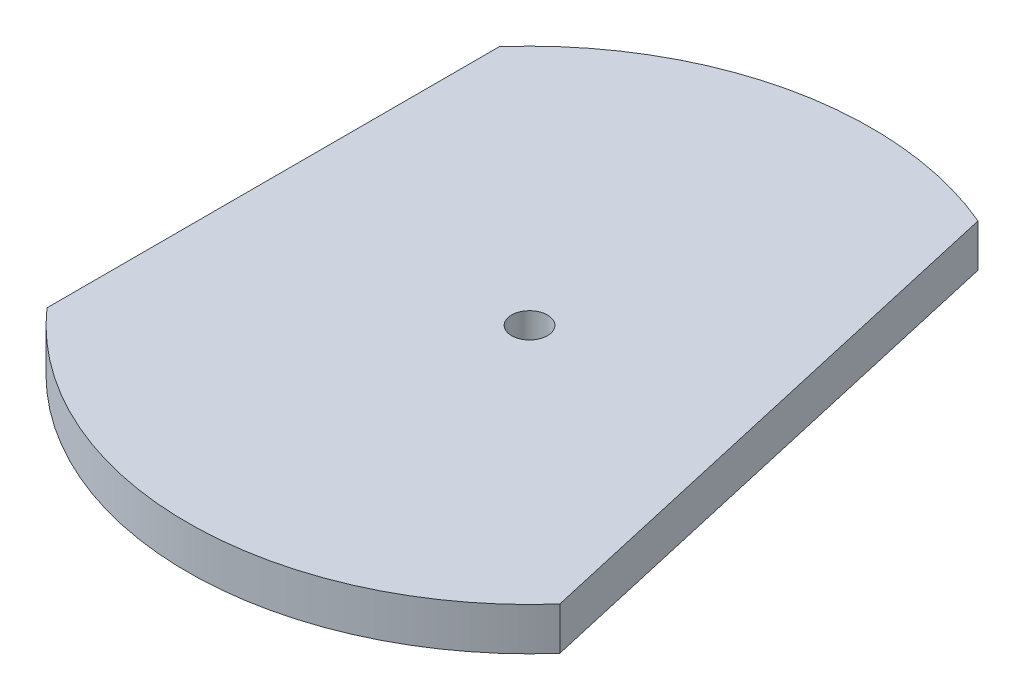
ISO-10303-21;
HEADER;
FILE_DESCRIPTION(('STEP AP214'),'2;1');
FILE_NAME('part.step','',(''),(''),'','','');
FILE_SCHEMA(('AUTOMOTIVE_DESIGN { 1 0 10303 214 1 1 1 1 }'));
ENDSEC;
DATA;
#1=APPLICATION_CONTEXT('core data for automotive mechanical design processes');
#2=APPLICATION_PROTOCOL_DEFINITION('international standard','automotive_design',2000,#1);
#3=PRODUCT_CONTEXT('',#1,'mechanical');
#4=PRODUCT('Part','Part','',(#3));
#5=PRODUCT_RELATED_PRODUCT_CATEGORY('part','',(#4));
#6=PRODUCT_DEFINITION_FORMATION('','',#4);
#7=PRODUCT_DEFINITION_CONTEXT('part definition',#1,'design');
#8=PRODUCT_DEFINITION('design','',#6,#7);
#9=PRODUCT_DEFINITION_SHAPE('','',#8);
#10=(LENGTH_UNIT() NAMED_UNIT(*) SI_UNIT(.MILLI.,.METRE.));
#11=(NAMED_UNIT(*) PLANE_ANGLE_UNIT() SI_UNIT($,.RADIAN.));
#12=(NAMED_UNIT(*) SI_UNIT($,.STERADIAN.) SOLID_ANGLE_UNIT());
#13=UNCERTAINTY_MEASURE_WITH_UNIT(LENGTH_MEASURE(1.E-05),#10,'distance_accuracy_value','');
#14=(GEOMETRIC_REPRESENTATION_CONTEXT(3) GLOBAL_UNCERTAINTY_ASSIGNED_CONTEXT((#13)) GLOBAL_UNIT_ASSIGNED_CONTEXT((#10,
#11,#12)) REPRESENTATION_CONTEXT('',''));
#15=CARTESIAN_POINT('',(0.,0.,0.));
#16=DIRECTION('',(0.,0.,1.));
#17=DIRECTION('',(1.,0.,0.));
#18=AXIS2_PLACEMENT_3D('',#15,#16,#17);
#19=CARTESIAN_POINT('',(0.,6.35,0.));
#20=DIRECTION('',(0.,1.,0.));
#21=DIRECTION('',(0.,0.,1.));
#22=AXIS2_PLACEMENT_3D('',#19,#20,#21);
#23=PLANE('',#22);
#24=CARTESIAN_POINT('',(0.,6.35,0.));
#25=DIRECTION('',(0.,1.,0.));
#26=DIRECTION('',(0.,0.,1.));
#27=AXIS2_PLACEMENT_3D('',#24,#25,#26);
#28=CIRCLE('',#27,2.66666666666667);
#29=CARTESIAN_POINT('',(0.,6.35,2.66666666666667));
#30=VERTEX_POINT('',#29);
#31=EDGE_CURVE('E96',#30,#30,#28,.T.);
#32=ORIENTED_EDGE('',*,*,#31,.F.);
#33=EDGE_LOOP('',(#32));
#34=FACE_BOUND('',#33,.T.);
#35=CARTESIAN_POINT('',(0.,6.35,0.));
#36=DIRECTION('',(0.,1.,0.));
#37=DIRECTION('',(0.,0.,1.));
#38=AXIS2_PLACEMENT_3D('',#35,#36,#37);
#39=CIRCLE('',#38,50.8);
#40=CARTESIAN_POINT('',(-38.1,6.35,33.6010416505203));
#41=VERTEX_POINT('',#40);
#42=CARTESIAN_POINT('',(38.1,6.35,33.6010416505203));
#43=VERTEX_POINT('',#42);
#44=EDGE_CURVE('E84',#41,#43,#39,.T.);
#45=ORIENTED_EDGE('',*,*,#44,.T.);
#46=DIRECTION('',(-0.221162934232346,0.,-0.975236872006868));
#47=VECTOR('',#46,1.);
#48=CARTESIAN_POINT('',(28.9891304347826,6.35,-6.57411684466701));
#49=LINE('',#48,#47);
#50=CARTESIAN_POINT('',(19.8782608695652,6.35,-46.7492753398543));
#51=VERTEX_POINT('',#50);
#52=EDGE_CURVE('E77',#43,#51,#49,.T.);
#53=ORIENTED_EDGE('',*,*,#52,.T.);
#54=CARTESIAN_POINT('',(-38.1,6.35,-33.6010416505203));
#55=VERTEX_POINT('',#54);
#56=EDGE_CURVE('E48',#51,#55,#39,.T.);
#57=ORIENTED_EDGE('',*,*,#56,.T.);
#58=DIRECTION('',(0.,0.,-1.));
#59=VECTOR('',#58,1.);
#60=CARTESIAN_POINT('',(-38.1,6.35,0.));
#61=LINE('',#60,#59);
#62=EDGE_CURVE('E105',#41,#55,#61,.T.);
#63=ORIENTED_EDGE('',*,*,#62,.F.);
#64=EDGE_LOOP('',(#45,#53,#57,#63));
#65=FACE_BOUND('',#64,.T.);
#66=ADVANCED_FACE('F33',(#34,#65),#23,.T.);
#67=CARTESIAN_POINT('',(0.,0.,0.));
#68=DIRECTION('',(0.,1.,0.));
#69=DIRECTION('',(0.,0.,1.));
#70=AXIS2_PLACEMENT_3D('',#67,#68,#69);
#71=PLANE('',#70);
#72=CARTESIAN_POINT('',(0.,0.,0.));
#73=DIRECTION('',(0.,1.,0.));
#74=DIRECTION('',(0.,0.,1.));
#75=AXIS2_PLACEMENT_3D('',#72,#73,#74);
#76=CIRCLE('',#75,2.66666666666667);
#77=CARTESIAN_POINT('',(0.,0.,2.66666666666667));
#78=VERTEX_POINT('',#77);
#79=EDGE_CURVE('E92',#78,#78,#76,.T.);
#80=ORIENTED_EDGE('',*,*,#79,.T.);
#81=EDGE_LOOP('',(#80));
#82=FACE_BOUND('',#81,.T.);
#83=DIRECTION('',(-0.221162934232346,0.,-0.975236872006868));
#84=VECTOR('',#83,1.);
#85=CARTESIAN_POINT('',(28.9891304347826,0.,-6.57411684466701));
#86=LINE('',#85,#84);
#87=CARTESIAN_POINT('',(38.1,0.,33.6010416505203));
#88=VERTEX_POINT('',#87);
#89=CARTESIAN_POINT('',(19.8782608695652,0.,-46.7492753398543));
#90=VERTEX_POINT('',#89);
#91=EDGE_CURVE('E80',#88,#90,#86,.T.);
#92=ORIENTED_EDGE('',*,*,#91,.F.);
#93=CARTESIAN_POINT('',(0.,0.,0.));
#94=DIRECTION('',(0.,1.,0.));
#95=DIRECTION('',(0.,0.,1.));
#96=AXIS2_PLACEMENT_3D('',#93,#94,#95);
#97=CIRCLE('',#96,50.8);
#98=CARTESIAN_POINT('',(-38.1,0.,33.6010416505203));
#99=VERTEX_POINT('',#98);
#100=EDGE_CURVE('E94',#99,#88,#97,.T.);
#101=ORIENTED_EDGE('',*,*,#100,.F.);
#102=DIRECTION('',(0.,0.,-1.));
#103=VECTOR('',#102,1.);
#104=CARTESIAN_POINT('',(-38.1,0.,0.));
#105=LINE('',#104,#103);
#106=CARTESIAN_POINT('',(-38.1,0.,-33.6010416505203));
#107=VERTEX_POINT('',#106);
#108=EDGE_CURVE('E104',#99,#107,#105,.T.);
#109=ORIENTED_EDGE('',*,*,#108,.T.);
#110=EDGE_CURVE('E56',#90,#107,#97,.T.);
#111=ORIENTED_EDGE('',*,*,#110,.F.);
#112=EDGE_LOOP('',(#92,#101,#109,#111));
#113=FACE_BOUND('',#112,.T.);
#114=ADVANCED_FACE('F103',(#82,#113),#71,.F.);
#115=CARTESIAN_POINT('',(0.,6.35,0.));
#116=DIRECTION('',(0.,-1.,0.));
#117=DIRECTION('',(0.,0.,-1.));
#118=AXIS2_PLACEMENT_3D('',#115,#116,#117);
#119=CYLINDRICAL_SURFACE('',#118,50.8);
#120=DIRECTION('',(0.,1.,0.));
#121=VECTOR('',#120,1.);
#122=CARTESIAN_POINT('',(19.8782608695652,-10.998,-46.7492753398543));
#123=LINE('',#122,#121);
#124=EDGE_CURVE('E75',#90,#51,#123,.T.);
#125=ORIENTED_EDGE('',*,*,#124,.F.);
#126=ORIENTED_EDGE('',*,*,#110,.T.);
#127=DIRECTION('',(0.,-1.,0.));
#128=VECTOR('',#127,1.);
#129=CARTESIAN_POINT('',(-38.1,6.35,-33.6010416505203));
#130=LINE('',#129,#128);
#131=EDGE_CURVE('E87',#107,#55,#130,.F.);
#132=ORIENTED_EDGE('',*,*,#131,.T.);
#133=ORIENTED_EDGE('',*,*,#56,.F.);
#134=EDGE_LOOP('',(#125,#126,#132,#133));
#135=FACE_BOUND('',#134,.T.);
#136=ADVANCED_FACE('F86',(#135),#119,.T.);
#137=DIRECTION('',(0.,-1.,0.));
#138=VECTOR('',#137,1.);
#139=CARTESIAN_POINT('',(38.1,6.35,33.6010416505203));
#140=LINE('',#139,#138);
#141=EDGE_CURVE('E11',#43,#88,#140,.T.);
#142=ORIENTED_EDGE('',*,*,#141,.F.);
#143=ORIENTED_EDGE('',*,*,#44,.F.);
#144=DIRECTION('',(0.,-1.,0.));
#145=VECTOR('',#144,1.);
#146=CARTESIAN_POINT('',(-38.1,6.35,33.6010416505203));
#147=LINE('',#146,#145);
#148=EDGE_CURVE('E41',#41,#99,#147,.T.);
#149=ORIENTED_EDGE('',*,*,#148,.T.);
#150=ORIENTED_EDGE('',*,*,#100,.T.);
#151=EDGE_LOOP('',(#142,#143,#149,#150));
#152=FACE_BOUND('',#151,.T.);
#153=ADVANCED_FACE('F35',(#152),#119,.T.);
#154=CARTESIAN_POINT('',(0.,6.35,0.));
#155=DIRECTION('',(0.,-1.,0.));
#156=DIRECTION('',(0.,0.,-1.));
#157=AXIS2_PLACEMENT_3D('',#154,#155,#156);
#158=CYLINDRICAL_SURFACE('',#157,2.66666666666667);
#159=ORIENTED_EDGE('',*,*,#31,.T.);
#160=EDGE_LOOP('',(#159));
#161=FACE_BOUND('',#160,.T.);
#162=ORIENTED_EDGE('',*,*,#79,.F.);
#163=EDGE_LOOP('',(#162));
#164=FACE_BOUND('',#163,.T.);
#165=ADVANCED_FACE('F116',(#161,#164),#158,.F.);
#166=CARTESIAN_POINT('',(-38.1,-6.35,0.));
#167=DIRECTION('',(1.,0.,0.));
#168=DIRECTION('',(0.,0.,-1.));
#169=AXIS2_PLACEMENT_3D('',#166,#167,#168);
#170=PLANE('',#169);
#171=ORIENTED_EDGE('',*,*,#148,.F.);
#172=ORIENTED_EDGE('',*,*,#62,.T.);
#173=ORIENTED_EDGE('',*,*,#131,.F.);
#174=ORIENTED_EDGE('',*,*,#108,.F.);
#175=EDGE_LOOP('',(#171,#172,#173,#174));
#176=FACE_BOUND('',#175,.T.);
#177=ADVANCED_FACE('F118',(#176),#170,.F.);
#178=CARTESIAN_POINT('',(28.9891304347826,-10.998,-6.57411684466701));
#179=DIRECTION('',(0.975236872006867,0.,-0.221162934232346));
#180=DIRECTION('',(-0.221162934232346,0.,-0.975236872006868));
#181=AXIS2_PLACEMENT_3D('',#178,#179,#180);
#182=PLANE('',#181);
#183=ORIENTED_EDGE('',*,*,#91,.T.);
#184=ORIENTED_EDGE('',*,*,#124,.T.);
#185=ORIENTED_EDGE('',*,*,#52,.F.);
#186=ORIENTED_EDGE('',*,*,#141,.T.);
#187=EDGE_LOOP('',(#183,#184,#185,#186));
#188=FACE_BOUND('',#187,.T.);
#189=ADVANCED_FACE('F76',(#188),#182,.T.);
#190=CLOSED_SHELL('',(#66,#114,#136,#153,#165,#177,#189));
#191=MANIFOLD_SOLID_BREP('B2',#190);
#192=ADVANCED_BREP_SHAPE_REPRESENTATION('',(#18,#191),#14);
#193=SHAPE_DEFINITION_REPRESENTATION(#9,#192);
ENDSEC;
END-ISO-10303-21;
